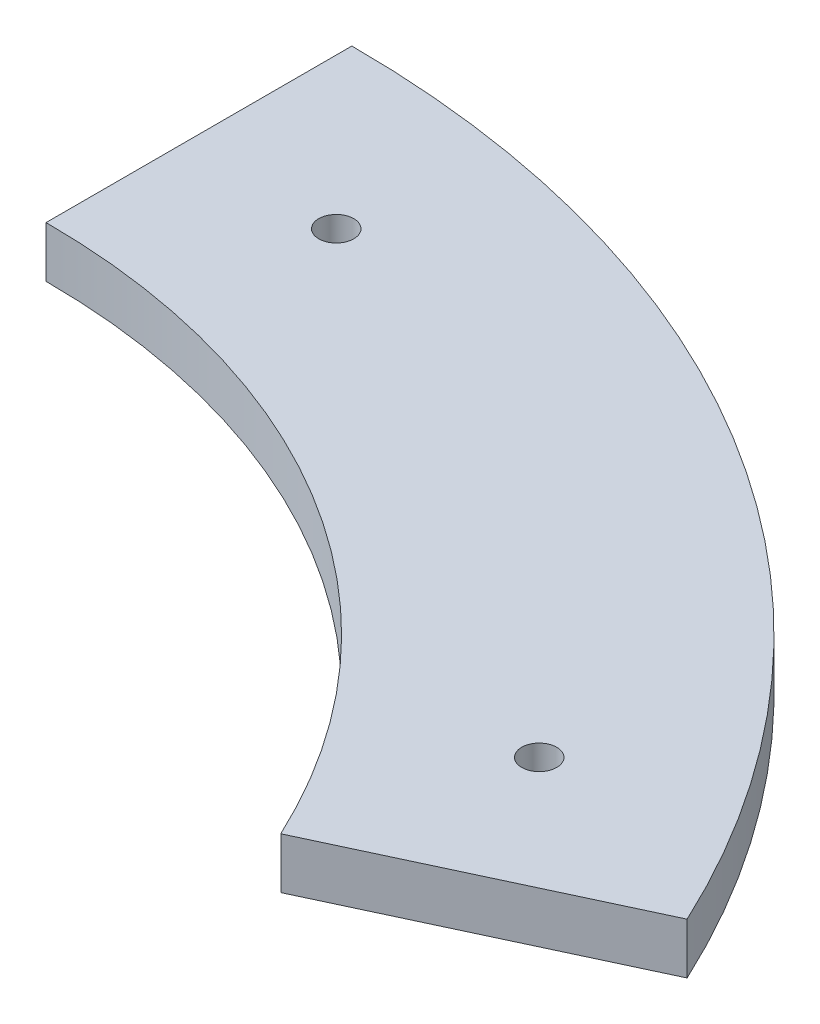
ISO-10303-21;
HEADER;
FILE_DESCRIPTION(('STEP AP214'),'2;1');
FILE_NAME('part.step','',(''),(''),'','','');
FILE_SCHEMA(('AUTOMOTIVE_DESIGN { 1 0 10303 214 1 1 1 1 }'));
ENDSEC;
DATA;
#1=APPLICATION_CONTEXT('core data for automotive mechanical design processes');
#2=APPLICATION_PROTOCOL_DEFINITION('international standard','automotive_design',2000,#1);
#3=PRODUCT_CONTEXT('',#1,'mechanical');
#4=PRODUCT('Part','Part','',(#3));
#5=PRODUCT_RELATED_PRODUCT_CATEGORY('part','',(#4));
#6=PRODUCT_DEFINITION_FORMATION('','',#4);
#7=PRODUCT_DEFINITION_CONTEXT('part definition',#1,'design');
#8=PRODUCT_DEFINITION('design','',#6,#7);
#9=PRODUCT_DEFINITION_SHAPE('','',#8);
#10=(LENGTH_UNIT() NAMED_UNIT(*) SI_UNIT(.MILLI.,.METRE.));
#11=(NAMED_UNIT(*) PLANE_ANGLE_UNIT() SI_UNIT($,.RADIAN.));
#12=(NAMED_UNIT(*) SI_UNIT($,.STERADIAN.) SOLID_ANGLE_UNIT());
#13=UNCERTAINTY_MEASURE_WITH_UNIT(LENGTH_MEASURE(1.E-05),#10,'distance_accuracy_value','');
#14=(GEOMETRIC_REPRESENTATION_CONTEXT(3) GLOBAL_UNCERTAINTY_ASSIGNED_CONTEXT((#13)) GLOBAL_UNIT_ASSIGNED_CONTEXT((#10,
#11,#12)) REPRESENTATION_CONTEXT('',''));
#15=CARTESIAN_POINT('',(0.,0.,0.));
#16=DIRECTION('',(0.,0.,1.));
#17=DIRECTION('',(1.,0.,0.));
#18=AXIS2_PLACEMENT_3D('',#15,#16,#17);
#19=CARTESIAN_POINT('',(161.141524535116,12.7,-75.1415269374965));
#20=DIRECTION('',(-0.4226182617407,0.,-0.90630778703665));
#21=DIRECTION('',(-0.90630778703665,0.,0.4226182617407));
#22=AXIS2_PLACEMENT_3D('',#19,#20,#21);
#23=PLANE('',#22);
#24=DIRECTION('',(0.906307787036649,0.,-0.4226182617407));
#25=VECTOR('',#24,1.);
#26=CARTESIAN_POINT('',(161.141524535116,0.,-75.1415269374965));
#27=LINE('',#26,#25);
#28=CARTESIAN_POINT('',(161.141524535116,0.,-75.1415269374965));
#29=VERTEX_POINT('',#28);
#30=CARTESIAN_POINT('',(230.202177907309,0.,-107.345038482138));
#31=VERTEX_POINT('',#30);
#32=EDGE_CURVE('E109',#29,#31,#27,.T.);
#33=ORIENTED_EDGE('',*,*,#32,.T.);
#34=DIRECTION('',(0.,-1.,0.));
#35=VECTOR('',#34,1.);
#36=CARTESIAN_POINT('',(230.202177907309,12.7,-107.345038482138));
#37=LINE('',#36,#35);
#38=CARTESIAN_POINT('',(230.202177907309,12.7,-107.345038482138));
#39=VERTEX_POINT('',#38);
#40=EDGE_CURVE('E11',#39,#31,#37,.T.);
#41=ORIENTED_EDGE('',*,*,#40,.F.);
#42=DIRECTION('',(0.906307787036649,0.,-0.4226182617407));
#43=VECTOR('',#42,1.);
#44=CARTESIAN_POINT('',(161.141524535116,12.7,-75.1415269374965));
#45=LINE('',#44,#43);
#46=CARTESIAN_POINT('',(161.141524535116,12.7,-75.1415269374965));
#47=VERTEX_POINT('',#46);
#48=EDGE_CURVE('E90',#47,#39,#45,.T.);
#49=ORIENTED_EDGE('',*,*,#48,.F.);
#50=DIRECTION('',(0.,-1.,0.));
#51=VECTOR('',#50,1.);
#52=CARTESIAN_POINT('',(161.141524535116,12.7,-75.1415269374965));
#53=LINE('',#52,#51);
#54=EDGE_CURVE('E57',#47,#29,#53,.T.);
#55=ORIENTED_EDGE('',*,*,#54,.T.);
#56=EDGE_LOOP('',(#33,#41,#49,#55));
#57=FACE_BOUND('',#56,.T.);
#58=ADVANCED_FACE('F40',(#57),#23,.F.);
#59=CARTESIAN_POINT('',(0.,12.7,0.));
#60=DIRECTION('',(0.,-1.,0.));
#61=DIRECTION('',(0.,0.,-1.));
#62=AXIS2_PLACEMENT_3D('',#59,#60,#61);
#63=CYLINDRICAL_SURFACE('',#62,254.);
#64=CARTESIAN_POINT('',(0.,0.,0.));
#65=DIRECTION('',(0.,1.,0.));
#66=DIRECTION('',(0.,0.,1.));
#67=AXIS2_PLACEMENT_3D('',#64,#65,#66);
#68=CIRCLE('',#67,254.);
#69=CARTESIAN_POINT('',(0.,0.,-254.));
#70=VERTEX_POINT('',#69);
#71=EDGE_CURVE('E96',#31,#70,#68,.T.);
#72=ORIENTED_EDGE('',*,*,#71,.T.);
#73=DIRECTION('',(0.,-1.,0.));
#74=VECTOR('',#73,1.);
#75=CARTESIAN_POINT('',(0.,12.7,-254.));
#76=LINE('',#75,#74);
#77=CARTESIAN_POINT('',(0.,12.7,-254.));
#78=VERTEX_POINT('',#77);
#79=EDGE_CURVE('E49',#78,#70,#76,.T.);
#80=ORIENTED_EDGE('',*,*,#79,.F.);
#81=CARTESIAN_POINT('',(0.,12.7,0.));
#82=DIRECTION('',(0.,1.,0.));
#83=DIRECTION('',(0.,0.,1.));
#84=AXIS2_PLACEMENT_3D('',#81,#82,#83);
#85=CIRCLE('',#84,254.);
#86=EDGE_CURVE('E82',#39,#78,#85,.T.);
#87=ORIENTED_EDGE('',*,*,#86,.F.);
#88=ORIENTED_EDGE('',*,*,#40,.T.);
#89=EDGE_LOOP('',(#72,#80,#87,#88));
#90=FACE_BOUND('',#89,.T.);
#91=ADVANCED_FACE('F95',(#90),#63,.T.);
#92=CARTESIAN_POINT('',(0.,12.7,-177.8));
#93=DIRECTION('',(-1.,0.,0.));
#94=DIRECTION('',(0.,0.,1.));
#95=AXIS2_PLACEMENT_3D('',#92,#93,#94);
#96=PLANE('',#95);
#97=DIRECTION('',(0.,0.,-1.));
#98=VECTOR('',#97,1.);
#99=CARTESIAN_POINT('',(0.,0.,-177.8));
#100=LINE('',#99,#98);
#101=CARTESIAN_POINT('',(0.,0.,-177.8));
#102=VERTEX_POINT('',#101);
#103=EDGE_CURVE('E115',#102,#70,#100,.T.);
#104=ORIENTED_EDGE('',*,*,#103,.F.);
#105=DIRECTION('',(0.,-1.,0.));
#106=VECTOR('',#105,1.);
#107=CARTESIAN_POINT('',(0.,12.7,-177.8));
#108=LINE('',#107,#106);
#109=CARTESIAN_POINT('',(0.,12.7,-177.8));
#110=VERTEX_POINT('',#109);
#111=EDGE_CURVE('E71',#110,#102,#108,.T.);
#112=ORIENTED_EDGE('',*,*,#111,.F.);
#113=DIRECTION('',(0.,0.,-1.));
#114=VECTOR('',#113,1.);
#115=CARTESIAN_POINT('',(0.,12.7,-177.8));
#116=LINE('',#115,#114);
#117=EDGE_CURVE('E89',#110,#78,#116,.T.);
#118=ORIENTED_EDGE('',*,*,#117,.T.);
#119=ORIENTED_EDGE('',*,*,#79,.T.);
#120=EDGE_LOOP('',(#104,#112,#118,#119));
#121=FACE_BOUND('',#120,.T.);
#122=ADVANCED_FACE('F100',(#121),#96,.T.);
#123=CARTESIAN_POINT('',(0.,12.7,0.));
#124=DIRECTION('',(0.,-1.,0.));
#125=DIRECTION('',(0.,0.,-1.));
#126=AXIS2_PLACEMENT_3D('',#123,#124,#125);
#127=CYLINDRICAL_SURFACE('',#126,177.8);
#128=CARTESIAN_POINT('',(0.,0.,0.));
#129=DIRECTION('',(0.,1.,0.));
#130=DIRECTION('',(0.,0.,1.));
#131=AXIS2_PLACEMENT_3D('',#128,#129,#130);
#132=CIRCLE('',#131,177.8);
#133=EDGE_CURVE('E118',#29,#102,#132,.T.);
#134=ORIENTED_EDGE('',*,*,#133,.F.);
#135=ORIENTED_EDGE('',*,*,#54,.F.);
#136=CARTESIAN_POINT('',(0.,12.7,0.));
#137=DIRECTION('',(0.,1.,0.));
#138=DIRECTION('',(0.,0.,1.));
#139=AXIS2_PLACEMENT_3D('',#136,#137,#138);
#140=CIRCLE('',#139,177.8);
#141=EDGE_CURVE('E102',#47,#110,#140,.T.);
#142=ORIENTED_EDGE('',*,*,#141,.T.);
#143=ORIENTED_EDGE('',*,*,#111,.T.);
#144=EDGE_LOOP('',(#134,#135,#142,#143));
#145=FACE_BOUND('',#144,.T.);
#146=ADVANCED_FACE('F157',(#145),#127,.F.);
#147=CARTESIAN_POINT('',(0.,12.7,0.));
#148=DIRECTION('',(0.,1.,0.));
#149=DIRECTION('',(0.,0.,1.));
#150=AXIS2_PLACEMENT_3D('',#147,#148,#149);
#151=PLANE('',#150);
#152=CARTESIAN_POINT('',(37.4906415582903,12.7,-212.619993875336));
#153=DIRECTION('',(0.,1.,0.));
#154=DIRECTION('',(0.,0.,1.));
#155=AXIS2_PLACEMENT_3D('',#152,#153,#154);
#156=CIRCLE('',#155,4.36562499999995);
#157=CARTESIAN_POINT('',(37.4906415582903,12.7,-208.254368875336));
#158=VERTEX_POINT('',#157);
#159=EDGE_CURVE('E146',#158,#158,#156,.T.);
#160=ORIENTED_EDGE('',*,*,#159,.F.);
#161=EDGE_LOOP('',(#160));
#162=FACE_BOUND('',#161,.T.);
#163=CARTESIAN_POINT('',(176.854926361993,12.7,-123.835152608191));
#164=DIRECTION('',(0.,1.,0.));
#165=DIRECTION('',(0.,0.,1.));
#166=AXIS2_PLACEMENT_3D('',#163,#164,#165);
#167=CIRCLE('',#166,4.36562499999996);
#168=CARTESIAN_POINT('',(176.854926361993,12.7,-119.469527608191));
#169=VERTEX_POINT('',#168);
#170=EDGE_CURVE('E138',#169,#169,#167,.T.);
#171=ORIENTED_EDGE('',*,*,#170,.F.);
#172=EDGE_LOOP('',(#171));
#173=FACE_BOUND('',#172,.T.);
#174=ORIENTED_EDGE('',*,*,#48,.T.);
#175=ORIENTED_EDGE('',*,*,#86,.T.);
#176=ORIENTED_EDGE('',*,*,#117,.F.);
#177=ORIENTED_EDGE('',*,*,#141,.F.);
#178=EDGE_LOOP('',(#174,#175,#176,#177));
#179=FACE_BOUND('',#178,.T.);
#180=ADVANCED_FACE('F86',(#162,#173,#179),#151,.T.);
#181=CARTESIAN_POINT('',(0.,0.,0.));
#182=DIRECTION('',(0.,1.,0.));
#183=DIRECTION('',(0.,0.,1.));
#184=AXIS2_PLACEMENT_3D('',#181,#182,#183);
#185=PLANE('',#184);
#186=CARTESIAN_POINT('',(37.4906415582903,0.,-212.619993875336));
#187=DIRECTION('',(0.,1.,0.));
#188=DIRECTION('',(0.,0.,1.));
#189=AXIS2_PLACEMENT_3D('',#186,#187,#188);
#190=CIRCLE('',#189,4.36562499999995);
#191=CARTESIAN_POINT('',(37.4906415582903,0.,-208.254368875336));
#192=VERTEX_POINT('',#191);
#193=EDGE_CURVE('E142',#192,#192,#190,.T.);
#194=ORIENTED_EDGE('',*,*,#193,.T.);
#195=EDGE_LOOP('',(#194));
#196=FACE_BOUND('',#195,.T.);
#197=CARTESIAN_POINT('',(176.854926361993,0.,-123.835152608191));
#198=DIRECTION('',(0.,1.,0.));
#199=DIRECTION('',(0.,0.,1.));
#200=AXIS2_PLACEMENT_3D('',#197,#198,#199);
#201=CIRCLE('',#200,4.36562499999996);
#202=CARTESIAN_POINT('',(176.854926361993,0.,-119.469527608191));
#203=VERTEX_POINT('',#202);
#204=EDGE_CURVE('E112',#203,#203,#201,.T.);
#205=ORIENTED_EDGE('',*,*,#204,.T.);
#206=EDGE_LOOP('',(#205));
#207=FACE_BOUND('',#206,.T.);
#208=ORIENTED_EDGE('',*,*,#32,.F.);
#209=ORIENTED_EDGE('',*,*,#133,.T.);
#210=ORIENTED_EDGE('',*,*,#103,.T.);
#211=ORIENTED_EDGE('',*,*,#71,.F.);
#212=EDGE_LOOP('',(#208,#209,#210,#211));
#213=FACE_BOUND('',#212,.T.);
#214=ADVANCED_FACE('F156',(#196,#207,#213),#185,.F.);
#215=CARTESIAN_POINT('',(176.854926361993,12.7,-123.835152608191));
#216=DIRECTION('',(0.,1.,0.));
#217=DIRECTION('',(0.,0.,1.));
#218=AXIS2_PLACEMENT_3D('',#215,#216,#217);
#219=CYLINDRICAL_SURFACE('',#218,4.36562499999996);
#220=ORIENTED_EDGE('',*,*,#204,.F.);
#221=EDGE_LOOP('',(#220));
#222=FACE_BOUND('',#221,.T.);
#223=ORIENTED_EDGE('',*,*,#170,.T.);
#224=EDGE_LOOP('',(#223));
#225=FACE_BOUND('',#224,.T.);
#226=ADVANCED_FACE('F161',(#222,#225),#219,.F.);
#227=CARTESIAN_POINT('',(37.4906415582903,12.7,-212.619993875336));
#228=DIRECTION('',(0.,1.,0.));
#229=DIRECTION('',(0.,0.,1.));
#230=AXIS2_PLACEMENT_3D('',#227,#228,#229);
#231=CYLINDRICAL_SURFACE('',#230,4.36562499999995);
#232=ORIENTED_EDGE('',*,*,#193,.F.);
#233=EDGE_LOOP('',(#232));
#234=FACE_BOUND('',#233,.T.);
#235=ORIENTED_EDGE('',*,*,#159,.T.);
#236=EDGE_LOOP('',(#235));
#237=FACE_BOUND('',#236,.T.);
#238=ADVANCED_FACE('F152',(#234,#237),#231,.F.);
#239=CLOSED_SHELL('',(#58,#91,#122,#146,#180,#214,#226,#238));
#240=MANIFOLD_SOLID_BREP('B2',#239);
#241=ADVANCED_BREP_SHAPE_REPRESENTATION('',(#18,#240),#14);
#242=SHAPE_DEFINITION_REPRESENTATION(#9,#241);
ENDSEC;
END-ISO-10303-21;
